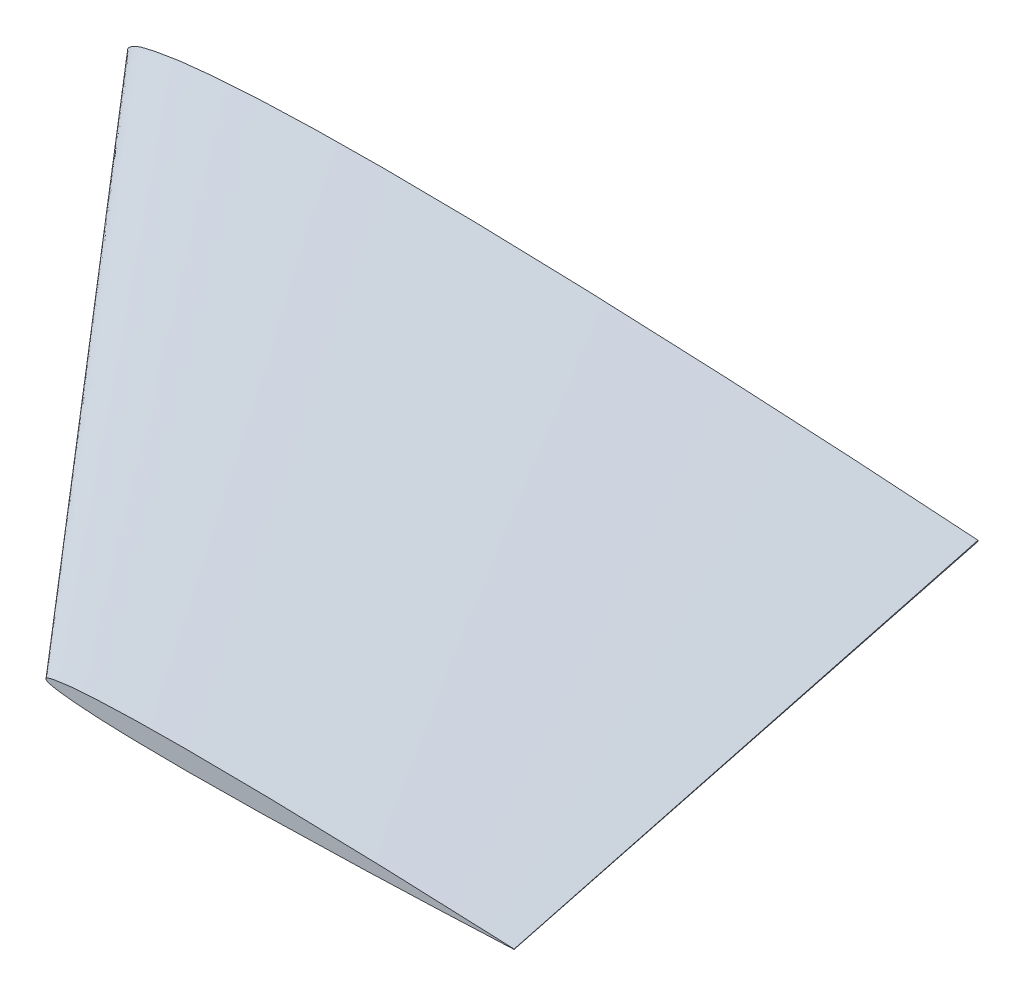
ISO-10303-21;
HEADER;
FILE_DESCRIPTION(('STEP AP214'),'2;1');
FILE_NAME('part.step','',(''),(''),'','','');
FILE_SCHEMA(('AUTOMOTIVE_DESIGN { 1 0 10303 214 1 1 1 1 }'));
ENDSEC;
DATA;
#1=APPLICATION_CONTEXT('core data for automotive mechanical design processes');
#2=APPLICATION_PROTOCOL_DEFINITION('international standard','automotive_design',2000,#1);
#3=PRODUCT_CONTEXT('',#1,'mechanical');
#4=PRODUCT('Part','Part','',(#3));
#5=PRODUCT_RELATED_PRODUCT_CATEGORY('part','',(#4));
#6=PRODUCT_DEFINITION_FORMATION('','',#4);
#7=PRODUCT_DEFINITION_CONTEXT('part definition',#1,'design');
#8=PRODUCT_DEFINITION('design','',#6,#7);
#9=PRODUCT_DEFINITION_SHAPE('','',#8);
#10=(LENGTH_UNIT() NAMED_UNIT(*) SI_UNIT(.MILLI.,.METRE.));
#11=(NAMED_UNIT(*) PLANE_ANGLE_UNIT() SI_UNIT($,.RADIAN.));
#12=(NAMED_UNIT(*) SI_UNIT($,.STERADIAN.) SOLID_ANGLE_UNIT());
#13=UNCERTAINTY_MEASURE_WITH_UNIT(LENGTH_MEASURE(1.E-05),#10,'distance_accuracy_value','');
#14=(GEOMETRIC_REPRESENTATION_CONTEXT(3) GLOBAL_UNCERTAINTY_ASSIGNED_CONTEXT((#13)) GLOBAL_UNIT_ASSIGNED_CONTEXT((#10,
#11,#12)) REPRESENTATION_CONTEXT('',''));
#15=CARTESIAN_POINT('',(0.,0.,0.));
#16=DIRECTION('',(0.,0.,1.));
#17=DIRECTION('',(1.,0.,0.));
#18=AXIS2_PLACEMENT_3D('',#15,#16,#17);
#19=CARTESIAN_POINT('',(76.5779623961027,0.615982799694228,1395.61087826198));
#20=DIRECTION('',(0.,0.,-1.));
#21=DIRECTION('',(-1.,0.,0.));
#22=AXIS2_PLACEMENT_3D('',#19,#20,#21);
#23=PLANE('',#22);
#24=CARTESIAN_POINT('',(1866.28144315743,1.36765826175248,1395.61087826198));
#25=CARTESIAN_POINT('',(1858.03998696573,1.75281795197239,1395.61087826198));
#26=CARTESIAN_POINT('',(1843.44107999446,2.43172211215009,1395.61087826198));
#27=CARTESIAN_POINT('',(1820.73553576436,3.46548490790183,1395.61087826198));
#28=CARTESIAN_POINT('',(1785.02316357086,5.07567969096857,1395.61087826198));
#29=CARTESIAN_POINT('',(1728.15704519696,7.55761274890985,1395.61087826198));
#30=CARTESIAN_POINT('',(1663.496115881,10.2530668783522,1395.61087826198));
#31=CARTESIAN_POINT('',(1602.88602362162,12.6717272302745,1395.61087826198));
#32=CARTESIAN_POINT('',(1531.92404523338,15.4168312076409,1395.61087826198));
#33=CARTESIAN_POINT('',(1456.42371707328,18.1799706374116,1395.61087826198));
#34=CARTESIAN_POINT('',(1354.87893759735,21.6791813206212,1395.61087826198));
#35=CARTESIAN_POINT('',(1268.65948230086,24.4388783123485,1395.61087826198));
#36=CARTESIAN_POINT('',(1179.90115355581,27.0430529301634,1395.61087826198));
#37=CARTESIAN_POINT('',(1111.13002696011,28.9157967842085,1395.61087826198));
#38=CARTESIAN_POINT('',(1041.49689729575,30.6565972311663,1395.61087826198));
#39=CARTESIAN_POINT('',(948.176207651098,32.755477546257,1395.61087826198));
#40=CARTESIAN_POINT('',(855.139229895098,34.4472528560126,1395.61087826198));
#41=CARTESIAN_POINT('',(762.961771765752,35.6218803919317,1395.61087826198));
#42=CARTESIAN_POINT('',(674.205782866961,36.3873933185213,1395.61087826198));
#43=CARTESIAN_POINT('',(587.983496703197,36.5413600259367,1395.61087826198));
#44=CARTESIAN_POINT('',(504.829825803553,35.9445256668117,1395.61087826198));
#45=CARTESIAN_POINT('',(446.526165550714,35.1366588283141,1395.61087826198));
#46=CARTESIAN_POINT('',(391.458385603536,33.9588300942018,1395.61087826198));
#47=CARTESIAN_POINT('',(339.965966441398,32.4096593361958,1395.61087826198));
#48=CARTESIAN_POINT('',(292.365851154612,30.5096479971527,1395.61087826198));
#49=CARTESIAN_POINT('',(248.950492203818,28.2697427515384,1395.61087826198));
#50=CARTESIAN_POINT('',(209.988369998775,25.7187070969961,1395.61087826198));
#51=CARTESIAN_POINT('',(175.714847788877,22.8741022153896,1395.61087826198));
#52=CARTESIAN_POINT('',(146.346535151869,19.8087026507204,1395.61087826198));
#53=CARTESIAN_POINT('',(122.035722645635,16.4522005158971,1395.61087826198));
#54=CARTESIAN_POINT('',(102.973616036386,13.1411651152886,1395.61087826198));
#55=CARTESIAN_POINT('',(89.0665391858227,9.23326235581858,1395.61087826198));
#56=CARTESIAN_POINT('',(80.4340963270998,6.32163056785005,1395.61087826198));
#57=CARTESIAN_POINT('',(75.2261298093573,0.61598279969401,1395.61087826198));
#58=CARTESIAN_POINT('',(80.4340963271006,-5.08966496846081,1395.61087826198));
#59=CARTESIAN_POINT('',(89.0665391858243,-8.00129675642827,1395.61087826198));
#60=CARTESIAN_POINT('',(102.973616036388,-11.9091995158959,1395.61087826198));
#61=CARTESIAN_POINT('',(122.035722645638,-15.2202349165017,1395.61087826198));
#62=CARTESIAN_POINT('',(146.346535151872,-18.5767370513211,1395.61087826198));
#63=CARTESIAN_POINT('',(175.714847788881,-21.6421366159859,1395.61087826198));
#64=CARTESIAN_POINT('',(209.988369998778,-24.486741497587,1395.61087826198));
#65=CARTESIAN_POINT('',(248.950492203823,-27.0377771521232,1395.61087826198));
#66=CARTESIAN_POINT('',(292.365851154617,-29.2776823977307,1395.61087826198));
#67=CARTESIAN_POINT('',(339.965966441403,-31.1776937367666,1395.61087826198));
#68=CARTESIAN_POINT('',(391.458385603541,-32.7268644947645,1395.61087826198));
#69=CARTESIAN_POINT('',(446.526165550719,-33.9046932288684,1395.61087826198));
#70=CARTESIAN_POINT('',(504.829825803559,-34.712560067357,1395.61087826198));
#71=CARTESIAN_POINT('',(587.983496703202,-35.3093944264691,1395.61087826198));
#72=CARTESIAN_POINT('',(674.205782866968,-35.1554277190404,1395.61087826198));
#73=CARTESIAN_POINT('',(762.961771765756,-34.389914792437,1395.61087826198));
#74=CARTESIAN_POINT('',(855.139229895102,-33.2152872565037,1395.61087826198));
#75=CARTESIAN_POINT('',(948.176207651104,-31.5235119467336,1395.61087826198));
#76=CARTESIAN_POINT('',(1041.49689729576,-29.4246316316285,1395.61087826198));
#77=CARTESIAN_POINT('',(1111.13002696012,-27.68383118466,1395.61087826198));
#78=CARTESIAN_POINT('',(1179.90115355581,-25.8110873306042,1395.61087826198));
#79=CARTESIAN_POINT('',(1308.57621506731,-22.0357534112568,1395.61087826198));
#80=CARTESIAN_POINT('',(1432.66272043579,-17.8630548924061,1395.61087826198));
#81=CARTESIAN_POINT('',(1551.39641480797,-13.4315934983389,1395.61087826198));
#82=CARTESIAN_POINT('',(1617.38702993467,-10.8788024943622,1395.61087826198));
#83=CARTESIAN_POINT('',(1677.99580792514,-8.42662701048359,1395.61087826198));
#84=CARTESIAN_POINT('',(1742.65509861642,-5.69287672134443,1395.61087826198));
#85=CARTESIAN_POINT('',(1785.02316357086,-3.84371409131575,1395.61087826198));
#86=CARTESIAN_POINT('',(1820.73553576436,-2.23351930824344,1395.61087826198));
#87=CARTESIAN_POINT('',(1842.52171839834,-1.24161421051452,1395.61087826198));
#88=CARTESIAN_POINT('',(1857.12067643761,-0.563815798329255,1395.61087826198));
#89=CARTESIAN_POINT('',(1865.36213262931,-0.178656108108071,1395.61087826198));
#90=CARTESIAN_POINT('',(1866.28144315743,-0.135692662087031,1395.61087826198));
#91=B_SPLINE_CURVE_WITH_KNOTS('',3,(#24,#25,#26,#27,#28,#29,#30,#31,#32,#33,#34,#35,#36,#37,#38,
#39,#40,#41,#42,#43,#44,#45,#46,#47,#48,#49,#50,#51,#52,#53,#54,#55,#56,#57,#58,#59,#60,#61,#62,
#63,#64,#65,#66,#67,#68,#69,#70,#71,#72,#73,#74,#75,#76,#77,#78,#79,#80,#81,#82,#83,#84,#85,#86,
#87,#88,#89,#90),.UNSPECIFIED.,.F.,.F.,(4,1,1,1,1,1,1,1,1,1,1,1,1,1,1,1,1,1,1,1,1,1,1,1,1,1,1,1,
1,1,1,1,1,1,1,1,1,1,1,1,1,1,1,1,1,1,1,1,1,1,1,1,1,1,1,1,1,1,1,1,1,1,1,1,4),(0.,
0.00689462452443807,0.0122129980770875,0.0189939135438821,0.036768569667984,0.0597793156848744,
0.0730757688774927,0.0874586832594532,0.119124190161914,0.136211022881369,0.17236657212777,
0.191211673140014,0.21041524145613,0.229857547050433,0.249419863694867,0.288419829497961,
0.307617824573225,0.326455527077329,0.362592745666242,0.379669911028139,0.39594558697329,
0.41131942363183,0.425698226139487,0.438994919331845,0.451128209388672,0.462026116437248,
0.471623197242087,0.479864509226328,0.48670418473288,0.492110985593961,0.496072413913456,
0.498623118658728,0.5,0.501376881341272,0.503927586086544,0.507889014406039,0.513295815267119,
0.520135490773672,0.528376802757913,0.537973883562752,0.548871790611328,0.561005080668155,
0.574301773860513,0.58868057636817,0.60405441302671,0.620330088971861,0.637407254333758,
0.673544472922671,0.692382175426775,0.711580170502039,0.750580136305133,0.770142452949567,
0.78958475854387,0.808788326859985,0.82763342787223,0.897160380173092,0.912541316740547,
0.926924231122507,0.95234774755356,0.963231430332016,0.981006086456118,0.987787001922912,
0.993105375475562,0.999230924636945,1.),.UNSPECIFIED.);
#92=CARTESIAN_POINT('',(1866.28144315743,1.36765826175248,1395.61087826198));
#93=VERTEX_POINT('',#92);
#94=CARTESIAN_POINT('',(1866.28144315743,-0.135692662087031,1395.61087826198));
#95=VERTEX_POINT('',#94);
#96=EDGE_CURVE('E71',#93,#95,#91,.T.);
#97=ORIENTED_EDGE('',*,*,#96,.T.);
#98=DIRECTION('',(0.,1.,0.));
#99=VECTOR('',#98,1.);
#100=CARTESIAN_POINT('',(1866.28144315743,1.36765826175248,1395.61087826198));
#101=LINE('',#100,#99);
#102=EDGE_CURVE('E12',#95,#93,#101,.T.);
#103=ORIENTED_EDGE('',*,*,#102,.T.);
#104=EDGE_LOOP('',(#97,#103));
#105=FACE_BOUND('',#104,.T.);
#106=ADVANCED_FACE('F61',(#105),#23,.F.);
#107=CARTESIAN_POINT('',(-1851.40689181907,-0.376671961057026,-844.389121738021));
#108=DIRECTION('',(0.,0.,-1.));
#109=DIRECTION('',(-1.,0.,0.));
#110=AXIS2_PLACEMENT_3D('',#107,#108,#109);
#111=PLANE('',#110);
#112=CARTESIAN_POINT('',(1399.79310818093,1.67158403894347,-844.389121738021));
#113=CARTESIAN_POINT('',(1345.60934463064,5.39975286530072,-844.389121738021));
#114=CARTESIAN_POINT('',(1237.25536645937,12.8551582701877,-844.389121738021));
#115=CARTESIAN_POINT('',(1020.52715564589,26.7196577477957,-844.389121738021));
#116=CARTESIAN_POINT('',(749.614087553848,42.6439620112682,-844.389121738021));
#117=CARTESIAN_POINT('',(424.487517147185,59.5453145162793,-844.389121738021));
#118=CARTESIAN_POINT('',(99.3696123874694,74.2703420997979,-844.389121738021));
#119=CARTESIAN_POINT('',(-225.751369122827,86.2537913927884,-844.389121738021));
#120=CARTESIAN_POINT('',(-550.879664862606,94.799718139497,-844.389121738021));
#121=CARTESIAN_POINT('',(-821.854085405467,97.7844668394347,-844.389121738021));
#122=CARTESIAN_POINT('',(-1038.62363982512,96.6034175275221,-844.389121738021));
#123=CARTESIAN_POINT('',(-1201.20279216903,93.3944988834554,-844.389121738021));
#124=CARTESIAN_POINT('',(-1363.86684358944,87.2108363007542,-844.389121738021));
#125=CARTESIAN_POINT('',(-1499.25114798667,78.6158475913071,-844.389121738021));
#126=CARTESIAN_POINT('',(-1607.86589666974,68.213438408184,-844.389121738021));
#127=CARTESIAN_POINT('',(-1688.59231589629,58.4055912619432,-844.389121738021));
#128=CARTESIAN_POINT('',(-1758.95329718924,44.8978081941674,-844.389121738021));
#129=CARTESIAN_POINT('',(-1810.53274060422,32.949652920047,-844.389121738021));
#130=CARTESIAN_POINT('',(-1873.74882941544,-0.376671961056696,-844.389121738021));
#131=CARTESIAN_POINT('',(-1810.53274060422,-33.7029968421598,-844.389121738021));
#132=CARTESIAN_POINT('',(-1758.95329718924,-45.6511521162806,-844.389121738021));
#133=CARTESIAN_POINT('',(-1688.59231589629,-59.1589351840563,-844.389121738021));
#134=CARTESIAN_POINT('',(-1607.86589666974,-68.966782330297,-844.389121738021));
#135=CARTESIAN_POINT('',(-1499.25114798667,-79.3691915134201,-844.389121738021));
#136=CARTESIAN_POINT('',(-1363.86684358944,-87.9641802228672,-844.389121738021));
#137=CARTESIAN_POINT('',(-1201.20279216903,-94.1478428055684,-844.389121738021));
#138=CARTESIAN_POINT('',(-1038.62363982512,-97.3567614496352,-844.389121738021));
#139=CARTESIAN_POINT('',(-821.854085405467,-98.5378107615477,-844.389121738021));
#140=CARTESIAN_POINT('',(-550.879664862605,-95.5530620616101,-844.389121738021));
#141=CARTESIAN_POINT('',(-225.751369122828,-87.0071353149015,-844.389121738021));
#142=CARTESIAN_POINT('',(99.3696123874701,-75.0236860219109,-844.389121738021));
#143=CARTESIAN_POINT('',(424.487517147185,-60.2986584383924,-844.389121738021));
#144=CARTESIAN_POINT('',(749.614087553845,-43.3973059333812,-844.389121738021));
#145=CARTESIAN_POINT('',(1020.52715564589,-27.4730016699087,-844.389121738021));
#146=CARTESIAN_POINT('',(1237.25536645937,-13.6085021923007,-844.389121738021));
#147=CARTESIAN_POINT('',(1345.60934463064,-6.15309678741377,-844.389121738021));
#148=CARTESIAN_POINT('',(1399.79310818093,-2.42492796105653,-844.389121738021));
#149=B_SPLINE_CURVE_WITH_KNOTS('',3,(#112,#113,#114,#115,#116,#117,#118,#119,#120,#121,#122,
#123,#124,#125,#126,#127,#128,#129,#130,#131,#132,#133,#134,#135,#136,#137,#138,#139,#140,#141,
#142,#143,#144,#145,#146,#147,#148),.UNSPECIFIED.,.F.,.F.,(4,1,1,1,1,1,1,1,1,1,1,1,1,1,1,1,1,1,
1,1,1,1,1,1,1,1,1,1,1,1,1,1,1,1,4),(0.,0.0249245577594703,0.0498428830048284,0.0996630479535091,
0.149464505803989,0.199249098798805,0.249016479528594,0.298766909273868,0.348503608962617,
0.373371187827416,0.398243492902326,0.423129722742987,0.448051612806012,0.46054281715137,
0.473079727808674,0.485731111482558,0.492200581361296,0.5,0.507799418638703,0.514268888517442,
0.526920272191325,0.53945718284863,0.551948387193988,0.576870277257013,0.601756507097674,
0.626628812172583,0.651496391037383,0.701233090726132,0.750983520471406,0.800750901201195,
0.850535494196011,0.900336952046491,0.950157116995171,0.97507544224053,1.),.UNSPECIFIED.);
#150=CARTESIAN_POINT('',(1399.79310818093,1.67158403894347,-844.389121738021));
#151=VERTEX_POINT('',#150);
#152=CARTESIAN_POINT('',(1399.79310818093,-2.42492796105653,-844.389121738021));
#153=VERTEX_POINT('',#152);
#154=EDGE_CURVE('E65',#151,#153,#149,.T.);
#155=ORIENTED_EDGE('',*,*,#154,.F.);
#156=DIRECTION('',(0.,1.,0.));
#157=VECTOR('',#156,1.);
#158=CARTESIAN_POINT('',(1399.79310818093,1.67158403894347,-844.389121738021));
#159=LINE('',#158,#157);
#160=EDGE_CURVE('E98',#153,#151,#159,.T.);
#161=ORIENTED_EDGE('',*,*,#160,.F.);
#162=EDGE_LOOP('',(#155,#161));
#163=FACE_BOUND('',#162,.T.);
#164=ADVANCED_FACE('F106',(#163),#111,.T.);
#165=CARTESIAN_POINT('',(1399.79310818093,1.67158403894347,-844.389121738021));
#166=CARTESIAN_POINT('',(1866.28144315743,1.36765826175248,1395.61087826198));
#167=CARTESIAN_POINT('',(1384.80480994891,2.70286910604488,-844.389121738021));
#168=CARTESIAN_POINT('',(1858.03998696573,1.75281795197239,1395.61087826198));
#169=CARTESIAN_POINT('',(1358.25484238539,4.52966656206227,-844.389121738021));
#170=CARTESIAN_POINT('',(1843.44107999446,2.43172211215009,1395.61087826198));
#171=CARTESIAN_POINT('',(1316.96287032778,7.35726873759861,-844.389121738021));
#172=CARTESIAN_POINT('',(1820.73553576436,3.46548490790183,1395.61087826198));
#173=CARTESIAN_POINT('',(1277.76505248488,10.0189223664547,-844.389121738021));
#174=CARTESIAN_POINT('',(1799.18191493458,4.43729175479104,1395.61087826198));
#175=CARTESIAN_POINT('',(1224.37689316734,13.5939780403511,-844.389121738021));
#176=CARTESIAN_POINT('',(1769.82633745588,5.73894819230268,1395.61087826198));
#177=CARTESIAN_POINT('',(1157.29808558201,17.9701715616933,-844.389121738021));
#178=CARTESIAN_POINT('',(1732.94556628465,7.33810900207473,1395.61087826198));
#179=CARTESIAN_POINT('',(1081.49872539561,22.7568147685766,-844.389121738021));
#180=CARTESIAN_POINT('',(1691.27363908081,9.09513363478949,1395.61087826198));
#181=CARTESIAN_POINT('',(1002.53287414017,27.6171809362167,-844.389121738021));
#182=CARTESIAN_POINT('',(1647.86317917148,10.8769029887087,1395.61087826198));
#183=CARTESIAN_POINT('',(920.712911325485,32.5216359290742,-844.389121738021));
#184=CARTESIAN_POINT('',(1602.88602362162,12.6717272302745,1395.61087826198));
#185=CARTESIAN_POINT('',(833.950124853211,37.5569401602073,-844.389121738021));
#186=CARTESIAN_POINT('',(1555.19481907818,14.5166210487829,1395.61087826198));
#187=CARTESIAN_POINT('',(733.766349559401,43.1886077788201,-844.389121738021));
#188=CARTESIAN_POINT('',(1500.12963295462,16.5804340204331,1395.61087826198));
#189=CARTESIAN_POINT('',(627.687263684861,48.9225219337905,-844.389121738021));
#190=CARTESIAN_POINT('',(1441.82802357507,18.6829350131419,1395.61087826198));
#191=CARTESIAN_POINT('',(519.311284438091,54.5119513920008,-844.389121738021));
#192=CARTESIAN_POINT('',(1382.268445279,20.7353449325556,1395.61087826198));
#193=CARTESIAN_POINT('',(403.435322948535,60.2509682224895,-844.389121738021));
#194=CARTESIAN_POINT('',(1318.59073082256,22.8406877895172,1395.61087826198));
#195=CARTESIAN_POINT('',(283.718492615657,65.8893347279325,-844.389121738021));
#196=CARTESIAN_POINT('',(1252.80651575991,24.904005288788,1395.61087826198));
#197=CARTESIAN_POINT('',(175.339805152009,70.6531866938896,-844.389121738021));
#198=CARTESIAN_POINT('',(1193.25737749872,26.6511805292997,1395.61087826198));
#199=CARTESIAN_POINT('',(92.5018978207741,74.1120237163389,-844.389121738021));
#200=CARTESIAN_POINT('',(1147.74407764271,27.9187397083422,1395.61087826198));
#201=CARTESIAN_POINT('',(8.35808273174643,77.4885120216638,-844.389121738021));
#202=CARTESIAN_POINT('',(1101.51503811179,29.1561676675128,1395.61087826198));
#203=CARTESIAN_POINT('',(-100.012276075009,81.5401421738719,-844.389121738021));
#204=CARTESIAN_POINT('',(1041.97945656597,30.6445334420286,1395.61087826198));
#205=CARTESIAN_POINT('',(-184.957729709699,84.3947806092598,-844.389121738021));
#206=CARTESIAN_POINT('',(995.31635524702,31.6952461204467,1395.61087826198));
#207=CARTESIAN_POINT('',(-312.505059055255,88.4159576119717,-844.389121738021));
#208=CARTESIAN_POINT('',(925.253331967212,33.1723048771307,1395.61087826198));
#209=CARTESIAN_POINT('',(-420.875093530224,91.3772601418218,-844.389121738021));
#210=CARTESIAN_POINT('',(865.728986465669,34.2546897576131,1395.61087826198));
#211=CARTESIAN_POINT('',(-547.666563002531,93.9429796082117,-844.389121738021));
#212=CARTESIAN_POINT('',(796.092743787977,35.1996887539885,1395.61087826198));
#213=CARTESIAN_POINT('',(-630.537152651573,95.3757374352711,-844.389121738021));
#214=CARTESIAN_POINT('',(750.580361607335,35.7286690114183,1395.61087826198));
#215=CARTESIAN_POINT('',(-738.90950535071,96.7529955818592,-844.389121738021));
#216=CARTESIAN_POINT('',(691.064972520815,36.2419842281379,1395.61087826198));
#217=CARTESIAN_POINT('',(-858.703457770431,97.340536117324,-844.389121738021));
#218=CARTESIAN_POINT('',(625.279152493002,36.4747613589523,1395.61087826198));
#219=CARTESIAN_POINT('',(-960.937049562254,97.0266858883417,-844.389121738021));
#220=CARTESIAN_POINT('',(569.137536026176,36.366525411012,1395.61087826198));
#221=CARTESIAN_POINT('',(-1028.84700010781,96.3818662278568,-844.389121738021));
#222=CARTESIAN_POINT('',(531.842957755714,36.1384120595854,1395.61087826198));
#223=CARTESIAN_POINT('',(-1101.51537998545,95.3353687030466,-844.389121738021));
#224=CARTESIAN_POINT('',(491.932935310345,35.7658238476804,1395.61087826198));
#225=CARTESIAN_POINT('',(-1155.70091704785,94.1788331487868,-844.389121738021));
#226=CARTESIAN_POINT('',(462.172104378743,35.3534519950126,1395.61087826198));
#227=CARTESIAN_POINT('',(-1224.64556815511,92.2464044224095,-844.389121738021));
#228=CARTESIAN_POINT('',(424.304932446606,34.661375334363,1395.61087826198));
#229=CARTESIAN_POINT('',(-1283.85917477494,90.2523222569762,-844.389121738021));
#230=CARTESIAN_POINT('',(391.782678451335,33.9439262363639,1395.61087826198));
#231=CARTESIAN_POINT('',(-1343.62319111281,87.5814464540071,-844.389121738021));
#232=CARTESIAN_POINT('',(358.942738160853,32.980583373316,1395.61087826198));
#233=CARTESIAN_POINT('',(-1403.82775090816,84.4483859622197,-844.389121738021));
#234=CARTESIAN_POINT('',(325.844169240742,31.8459721550355,1395.61087826198));
#235=CARTESIAN_POINT('',(-1458.00798808295,81.1577350145544,-844.389121738021));
#236=CARTESIAN_POINT('',(296.044595663929,30.6564891600161,1395.61087826198));
#237=CARTESIAN_POINT('',(-1513.28503620231,76.8913179576922,-844.389121738021));
#238=CARTESIAN_POINT('',(265.651381970232,29.1313827678426,1395.61087826198));
#239=CARTESIAN_POINT('',(-1560.13299547654,72.7849830255556,-844.389121738021));
#240=CARTESIAN_POINT('',(239.907819039267,27.6627440447532,1395.61087826198));
#241=CARTESIAN_POINT('',(-1590.46511908173,69.7853069624644,-844.389121738021));
#242=CARTESIAN_POINT('',(223.2196880708,26.5850244906097,1395.61087826198));
#243=CARTESIAN_POINT('',(-1634.66442301157,64.9215759001836,-844.389121738021));
#244=CARTESIAN_POINT('',(198.759653355532,24.7867555461187,1395.61087826198));
#245=CARTESIAN_POINT('',(-1661.59698370172,61.5831690227419,-844.389121738021));
#246=CARTESIAN_POINT('',(183.806994583034,23.5457273880919,1395.61087826198));
#247=CARTESIAN_POINT('',(-1700.44340286803,55.6342491136035,-844.389121738021));
#248=CARTESIAN_POINT('',(162.560418088984,21.5010719165802,1395.61087826198));
#249=CARTESIAN_POINT('',(-1731.53575326664,50.1613822483118,-844.389121738021));
#250=CARTESIAN_POINT('',(145.775903704387,19.6946738463731,1395.61087826198));
#251=CARTESIAN_POINT('',(-1760.33482802585,44.2651511198876,-844.389121738021));
#252=CARTESIAN_POINT('',(129.606082153058,17.4974114828909,1395.61087826198));
#253=CARTESIAN_POINT('',(-1784.87829771761,38.8901231890469,-844.389121738021));
#254=CARTESIAN_POINT('',(115.136015385441,15.2537403739705,1395.61087826198));
#255=CARTESIAN_POINT('',(-1797.69444211186,35.5552605917878,-844.389121738021));
#256=CARTESIAN_POINT('',(107.527275889843,13.9321232861872,1395.61087826198));
#257=CARTESIAN_POINT('',(-1819.61726206436,26.9308619852756,-844.389121738021));
#258=CARTESIAN_POINT('',(96.5603905928929,11.339042233749,1395.61087826198));
#259=CARTESIAN_POINT('',(-1836.57140003616,19.0079602953246,-844.389121738021));
#260=CARTESIAN_POINT('',(88.9685002798073,9.20019486844757,1395.61087826198));
#261=CARTESIAN_POINT('',(-1849.42071184849,7.63383847682238,-844.389121738021));
#262=CARTESIAN_POINT('',(80.4340963270998,6.32163056785005,1395.61087826198));
#263=CARTESIAN_POINT('',(-1852.10318060348,-0.376671961057112,-844.389121738021));
#264=CARTESIAN_POINT('',(75.2261298093573,0.61598279969401,1395.61087826198));
#265=CARTESIAN_POINT('',(-1849.42071184849,-8.38718239893658,-844.389121738021));
#266=CARTESIAN_POINT('',(80.4340963271006,-5.08966496846081,1395.61087826198));
#267=CARTESIAN_POINT('',(-1836.57140003616,-19.7613042174386,-844.389121738021));
#268=CARTESIAN_POINT('',(88.9685002798086,-7.96822926905716,1395.61087826198));
#269=CARTESIAN_POINT('',(-1819.61726206436,-27.6842059073894,-844.389121738021));
#270=CARTESIAN_POINT('',(96.5603905928947,-10.1070766343573,1395.61087826198));
#271=CARTESIAN_POINT('',(-1797.69444211186,-36.3086045139012,-844.389121738021));
#272=CARTESIAN_POINT('',(107.527275889845,-12.7001576867938,1395.61087826198));
#273=CARTESIAN_POINT('',(-1784.87829771761,-39.6434671111602,-844.389121738021));
#274=CARTESIAN_POINT('',(115.136015385442,-14.021774774576,1395.61087826198));
#275=CARTESIAN_POINT('',(-1760.33482802585,-45.018495042001,-844.389121738021));
#276=CARTESIAN_POINT('',(129.606082153061,-16.2654458834942,1395.61087826198));
#277=CARTESIAN_POINT('',(-1731.53575326664,-50.9147261704251,-844.389121738021));
#278=CARTESIAN_POINT('',(145.775903704389,-18.4627082469738,1395.61087826198));
#279=CARTESIAN_POINT('',(-1700.44340286803,-56.3875930357168,-844.389121738021));
#280=CARTESIAN_POINT('',(162.560418088988,-20.2691063171783,1395.61087826198));
#281=CARTESIAN_POINT('',(-1661.59698370172,-62.3365129448552,-844.389121738021));
#282=CARTESIAN_POINT('',(183.806994583038,-22.3137617886868,1395.61087826198));
#283=CARTESIAN_POINT('',(-1634.66442301157,-65.6749198222969,-844.389121738021));
#284=CARTESIAN_POINT('',(198.759653355535,-23.5547899467113,1395.61087826198));
#285=CARTESIAN_POINT('',(-1590.46511908173,-70.5386508845776,-844.389121738021));
#286=CARTESIAN_POINT('',(223.219688070803,-25.3530588911985,1395.61087826198));
#287=CARTESIAN_POINT('',(-1560.13299547654,-73.5383269476687,-844.389121738021));
#288=CARTESIAN_POINT('',(239.90781903927,-26.4307784453394,1395.61087826198));
#289=CARTESIAN_POINT('',(-1513.28503620231,-77.6446618798054,-844.389121738021));
#290=CARTESIAN_POINT('',(265.651381970236,-27.8994171684249,1395.61087826198));
#291=CARTESIAN_POINT('',(-1458.00798808295,-81.9110789366676,-844.389121738021));
#292=CARTESIAN_POINT('',(296.044595663933,-29.4245235605936,1395.61087826198));
#293=CARTESIAN_POINT('',(-1403.82775090816,-85.2017298843328,-844.389121738021));
#294=CARTESIAN_POINT('',(325.844169240747,-30.6140065556085,1395.61087826198));
#295=CARTESIAN_POINT('',(-1343.62319111281,-88.3347903761201,-844.389121738021));
#296=CARTESIAN_POINT('',(358.942738160857,-31.7486177738838,1395.61087826198));
#297=CARTESIAN_POINT('',(-1283.85917477494,-91.0056661790892,-844.389121738021));
#298=CARTESIAN_POINT('',(391.782678451338,-32.7119606369266,1395.61087826198));
#299=CARTESIAN_POINT('',(-1224.64556815511,-92.9997483445226,-844.389121738021));
#300=CARTESIAN_POINT('',(424.30493244661,-33.4294097349207,1395.61087826198));
#301=CARTESIAN_POINT('',(-1155.70091704785,-94.9321770708998,-844.389121738021));
#302=CARTESIAN_POINT('',(462.172104378748,-34.1214863955645,1395.61087826198));
#303=CARTESIAN_POINT('',(-1101.51537998545,-96.0887126251597,-844.389121738021));
#304=CARTESIAN_POINT('',(491.93293531035,-34.5338582482276,1395.61087826198));
#305=CARTESIAN_POINT('',(-1028.84700010781,-97.1352101499699,-844.389121738021));
#306=CARTESIAN_POINT('',(531.842957755719,-34.9064464601266,1395.61087826198));
#307=CARTESIAN_POINT('',(-960.937049562253,-97.7800298104548,-844.389121738021));
#308=CARTESIAN_POINT('',(569.13753602618,-35.1345598115473,1395.61087826198));
#309=CARTESIAN_POINT('',(-858.70345777043,-98.0938800394371,-844.389121738021));
#310=CARTESIAN_POINT('',(625.279152493007,-35.242795759479,1395.61087826198));
#311=CARTESIAN_POINT('',(-738.909505350709,-97.5063395039723,-844.389121738021));
#312=CARTESIAN_POINT('',(691.064972520821,-35.0100186286544,1395.61087826198));
#313=CARTESIAN_POINT('',(-630.537152651572,-96.1290813573841,-844.389121738021));
#314=CARTESIAN_POINT('',(750.58036160734,-34.4967034119256,1395.61087826198));
#315=CARTESIAN_POINT('',(-547.66656300253,-94.6963235303247,-844.389121738021));
#316=CARTESIAN_POINT('',(796.092743787982,-33.9677231544887,1395.61087826198));
#317=CARTESIAN_POINT('',(-420.875093530223,-92.1306040639349,-844.389121738021));
#318=CARTESIAN_POINT('',(865.728986465674,-33.0227241581026,1395.61087826198));
#319=CARTESIAN_POINT('',(-312.505059055254,-89.1693015340848,-844.389121738021));
#320=CARTESIAN_POINT('',(925.253331967217,-31.9403392776109,1395.61087826198));
#321=CARTESIAN_POINT('',(-184.957729709698,-85.1481245313729,-844.389121738021));
#322=CARTESIAN_POINT('',(995.316355247025,-30.463280520916,1395.61087826198));
#323=CARTESIAN_POINT('',(-100.012276075008,-82.2934860959849,-844.389121738021));
#324=CARTESIAN_POINT('',(1041.97945656597,-29.4125678424907,1395.61087826198));
#325=CARTESIAN_POINT('',(8.35808273174754,-78.2418559437768,-844.389121738021));
#326=CARTESIAN_POINT('',(1101.51503811179,-27.9242020679657,1395.61087826198));
#327=CARTESIAN_POINT('',(92.5018978207752,-74.8653676384518,-844.389121738021));
#328=CARTESIAN_POINT('',(1147.74407764272,-26.686774108788,1395.61087826198));
#329=CARTESIAN_POINT('',(175.33980515201,-71.4065306160026,-844.389121738021));
#330=CARTESIAN_POINT('',(1193.25737749872,-25.4192149297384,1395.61087826198));
#331=CARTESIAN_POINT('',(283.718492615658,-66.6426786500455,-844.389121738021));
#332=CARTESIAN_POINT('',(1252.80651575992,-23.6720396892174,1395.61087826198));
#333=CARTESIAN_POINT('',(476.072984115331,-57.5832580236591,-844.389121738021));
#334=CARTESIAN_POINT('',(1358.50499408104,-20.3567816196026,1395.61087826198));
#335=CARTESIAN_POINT('',(634.286574611096,-49.3924817424012,-844.389121738021));
#336=CARTESIAN_POINT('',(1445.45377339939,-17.3462688559147,1395.61087826198));
#337=CARTESIAN_POINT('',(769.195354282966,-41.9503679532031,-844.389121738021));
#338=CARTESIAN_POINT('',(1519.60287739402,-14.6182139802145,1395.61087826198));
#339=CARTESIAN_POINT('',(833.950124853211,-38.3102840823204,-844.389121738021));
#340=CARTESIAN_POINT('',(1555.19481907818,-13.2846554491656,1395.61087826198));
#341=CARTESIAN_POINT('',(942.328556047705,-32.0205094525994,-844.389121738021));
#342=CARTESIAN_POINT('',(1614.76757071918,-10.9801340535203,1395.61087826198));
#343=CARTESIAN_POINT('',(1028.90997870251,-26.7713700411267,-844.389121738021));
#344=CARTESIAN_POINT('',(1662.36321020013,-9.05910755474801,1395.61087826198));
#345=CARTESIAN_POINT('',(1107.87169967879,-21.8447354221094,-844.389121738021));
#346=CARTESIAN_POINT('',(1705.77262719236,-7.25224221765159,1395.61087826198));
#347=CARTESIAN_POINT('',(1162.06145007309,-18.4127555646002,-844.389121738021));
#348=CARTESIAN_POINT('',(1735.5645273711,-5.99266119136927,1395.61087826198));
#349=CARTESIAN_POINT('',(1224.37689316734,-14.3473219624641,-844.389121738021));
#350=CARTESIAN_POINT('',(1769.82633745588,-4.5069825926522,1395.61087826198));
#351=CARTESIAN_POINT('',(1277.76505248488,-10.7722662885677,-844.389121738021));
#352=CARTESIAN_POINT('',(1799.18191493458,-3.20532615513601,1395.61087826198));
#353=CARTESIAN_POINT('',(1316.96287032778,-8.11061265971159,-844.389121738021));
#354=CARTESIAN_POINT('',(1820.73553576436,-2.23351930824344,1395.61087826198));
#355=CARTESIAN_POINT('',(1356.58290477611,-5.39750185346057,-844.389121738021));
#356=CARTESIAN_POINT('',(1842.52171839834,-1.24161421051452,1395.61087826198));
#357=CARTESIAN_POINT('',(1383.1329087651,-3.57124988543461,-844.389121738021));
#358=CARTESIAN_POINT('',(1857.12067643761,-0.563815798329255,1395.61087826198));
#359=CARTESIAN_POINT('',(1398.12120699712,-2.53996481833321,-844.389121738021));
#360=CARTESIAN_POINT('',(1865.36213262931,-0.178656108108071,1395.61087826198));
#361=CARTESIAN_POINT('',(1399.79310818093,-2.42492796105653,-844.389121738021));
#362=CARTESIAN_POINT('',(1866.28144315743,-0.135692662087031,1395.61087826198));
#363=B_SPLINE_SURFACE_WITH_KNOTS('',3,1,((#165,#166),(#167,#168),(#169,#170),(#171,#172),(#173,
#174),(#175,#176),(#177,#178),(#179,#180),(#181,#182),(#183,#184),(#185,#186),(#187,#188),(#189,
#190),(#191,#192),(#193,#194),(#195,#196),(#197,#198),(#199,#200),(#201,#202),(#203,#204),(#205,
#206),(#207,#208),(#209,#210),(#211,#212),(#213,#214),(#215,#216),(#217,#218),(#219,#220),(#221,
#222),(#223,#224),(#225,#226),(#227,#228),(#229,#230),(#231,#232),(#233,#234),(#235,#236),(#237,
#238),(#239,#240),(#241,#242),(#243,#244),(#245,#246),(#247,#248),(#249,#250),(#251,#252),(#253,
#254),(#255,#256),(#257,#258),(#259,#260),(#261,#262),(#263,#264),(#265,#266),(#267,#268),(#269,
#270),(#271,#272),(#273,#274),(#275,#276),(#277,#278),(#279,#280),(#281,#282),(#283,#284),(#285,
#286),(#287,#288),(#289,#290),(#291,#292),(#293,#294),(#295,#296),(#297,#298),(#299,#300),(#301,
#302),(#303,#304),(#305,#306),(#307,#308),(#309,#310),(#311,#312),(#313,#314),(#315,#316),(#317,
#318),(#319,#320),(#321,#322),(#323,#324),(#325,#326),(#327,#328),(#329,#330),(#331,#332),(#333,
#334),(#335,#336),(#337,#338),(#339,#340),(#341,#342),(#343,#344),(#345,#346),(#347,#348),(#349,
#350),(#351,#352),(#353,#354),(#355,#356),(#357,#358),(#359,#360),(#361,#362)),.UNSPECIFIED.,
.F.,.F.,.F.,(4,1,1,1,1,1,1,1,1,1,1,1,1,1,1,1,1,1,1,1,1,1,1,1,1,1,1,1,1,1,1,1,1,1,1,1,1,1,1,1,1,
1,1,1,1,1,1,1,1,1,1,1,1,1,1,1,1,1,1,1,1,1,1,1,1,1,1,1,1,1,1,1,1,1,1,1,1,1,1,1,1,1,1,1,1,1,1,1,1,
1,1,1,1,1,1,1,4),(2,2),(0.,0.00689462452443808,0.0122129980770875,0.0189939135438821,
0.0249245577594703,0.036768569667984,0.0498428830048284,0.0597793156848744,0.0730757688774927,
0.0874586832594532,0.0996630479535091,0.119124190161914,0.136211022881369,0.149464505803989,
0.17236657212777,0.191211673140014,0.199249098798805,0.21041524145613,0.229857547050433,
0.249016479528594,0.249419863694867,0.288419829497961,0.298766909273868,0.307617824573225,
0.326455527077329,0.348503608962617,0.362592745666242,0.373371187827416,0.379669911028139,
0.39594558697329,0.398243492902326,0.41131942363183,0.423129722742987,0.425698226139487,
0.438994919331845,0.448051612806012,0.451128209388672,0.46054281715137,0.462026116437248,
0.471623197242087,0.473079727808674,0.479864509226328,0.485731111482558,0.486704184732881,
0.492110985593961,0.492200581361296,0.496072413913456,0.498623118658728,0.5,0.501376881341272,
0.503927586086544,0.507799418638703,0.507889014406039,0.51329581526712,0.514268888517442,
0.520135490773672,0.526920272191325,0.528376802757913,0.537973883562752,0.53945718284863,
0.548871790611328,0.551948387193988,0.561005080668155,0.574301773860513,0.576870277257013,
0.58868057636817,0.601756507097674,0.60405441302671,0.620330088971861,0.626628812172583,
0.637407254333759,0.651496391037383,0.673544472922671,0.692382175426775,0.701233090726132,
0.711580170502039,0.750580136305133,0.750983520471406,0.770142452949567,0.78958475854387,
0.800750901201195,0.808788326859986,0.82763342787223,0.850535494196011,0.897160380173092,
0.900336952046491,0.912541316740547,0.926924231122507,0.950157116995171,0.95234774755356,
0.963231430332016,0.97507544224053,0.981006086456118,0.987787001922913,0.993105375475562,
0.999230924636945,1.),(0.,1.),.UNSPECIFIED.);
#364=DIRECTION('',(0.203879453395807,0.00100051385308875,0.978995488986061));
#365=VECTOR('',#364,1.);
#366=CARTESIAN_POINT('',(1633.03727566918,-1.28031031157178,275.610878261979));
#367=LINE('',#366,#365);
#368=EDGE_CURVE('E79',#153,#95,#367,.T.);
#369=DIRECTION('',(-0.20387955364176,0.00013283129962306,-0.978995970350584));
#370=VECTOR('',#369,1.);
#371=CARTESIAN_POINT('',(1633.03727566918,1.51962115034798,275.610878261979));
#372=LINE('',#371,#370);
#373=EDGE_CURVE('E91',#93,#151,#372,.T.);
#374=ORIENTED_EDGE('',*,*,#154,.T.);
#375=ORIENTED_EDGE('',*,*,#368,.T.);
#376=ORIENTED_EDGE('',*,*,#96,.F.);
#377=ORIENTED_EDGE('',*,*,#373,.T.);
#378=EDGE_LOOP('',(#374,#375,#376,#377));
#379=FACE_BOUND('',#378,.T.);
#380=ADVANCED_FACE('F93',(#379),#363,.T.);
#381=CARTESIAN_POINT('',(1264.65089027181,-0.376671961056526,-1493.31974962111));
#382=DIRECTION('',(-0.978995978987362,0.,0.203879555440401));
#383=DIRECTION('',(0.203879555440401,0.,0.978995978987363));
#384=AXIS2_PLACEMENT_3D('',#381,#382,#383);
#385=PLANE('',#384);
#386=ORIENTED_EDGE('',*,*,#373,.F.);
#387=ORIENTED_EDGE('',*,*,#102,.F.);
#388=ORIENTED_EDGE('',*,*,#368,.F.);
#389=ORIENTED_EDGE('',*,*,#160,.T.);
#390=EDGE_LOOP('',(#386,#387,#388,#389));
#391=FACE_BOUND('',#390,.T.);
#392=ADVANCED_FACE('F101',(#391),#385,.F.);
#393=CLOSED_SHELL('',(#106,#164,#380,#392));
#394=MANIFOLD_SOLID_BREP('B2',#393);
#395=ADVANCED_BREP_SHAPE_REPRESENTATION('',(#18,#394),#14);
#396=SHAPE_DEFINITION_REPRESENTATION(#9,#395);
ENDSEC;
END-ISO-10303-21;
